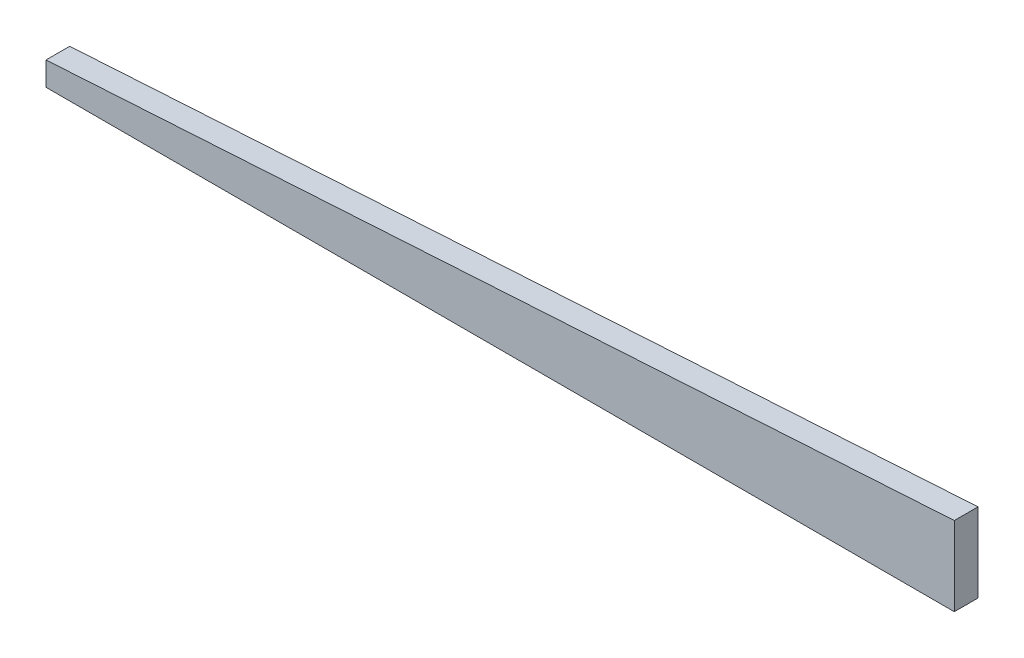
ISO-10303-21;
HEADER;
FILE_DESCRIPTION(('STEP AP214'),'2;1');
FILE_NAME('part.step','',(''),(''),'','','');
FILE_SCHEMA(('AUTOMOTIVE_DESIGN { 1 0 10303 214 1 1 1 1 }'));
ENDSEC;
DATA;
#1=APPLICATION_CONTEXT('core data for automotive mechanical design processes');
#2=APPLICATION_PROTOCOL_DEFINITION('international standard','automotive_design',2000,#1);
#3=PRODUCT_CONTEXT('',#1,'mechanical');
#4=PRODUCT('Part','Part','',(#3));
#5=PRODUCT_RELATED_PRODUCT_CATEGORY('part','',(#4));
#6=PRODUCT_DEFINITION_FORMATION('','',#4);
#7=PRODUCT_DEFINITION_CONTEXT('part definition',#1,'design');
#8=PRODUCT_DEFINITION('design','',#6,#7);
#9=PRODUCT_DEFINITION_SHAPE('','',#8);
#10=(LENGTH_UNIT() NAMED_UNIT(*) SI_UNIT(.MILLI.,.METRE.));
#11=(NAMED_UNIT(*) PLANE_ANGLE_UNIT() SI_UNIT($,.RADIAN.));
#12=(NAMED_UNIT(*) SI_UNIT($,.STERADIAN.) SOLID_ANGLE_UNIT());
#13=UNCERTAINTY_MEASURE_WITH_UNIT(LENGTH_MEASURE(1.E-05),#10,'distance_accuracy_value','');
#14=(GEOMETRIC_REPRESENTATION_CONTEXT(3) GLOBAL_UNCERTAINTY_ASSIGNED_CONTEXT((#13)) GLOBAL_UNIT_ASSIGNED_CONTEXT((#10,
#11,#12)) REPRESENTATION_CONTEXT('',''));
#15=CARTESIAN_POINT('',(0.,0.,0.));
#16=DIRECTION('',(0.,0.,1.));
#17=DIRECTION('',(1.,0.,0.));
#18=AXIS2_PLACEMENT_3D('',#15,#16,#17);
#19=CARTESIAN_POINT('',(0.,10.,3.));
#20=DIRECTION('',(-1.,0.,0.));
#21=DIRECTION('',(0.,0.,1.));
#22=AXIS2_PLACEMENT_3D('',#19,#20,#21);
#23=PLANE('',#22);
#24=DIRECTION('',(0.,1.,0.));
#25=VECTOR('',#24,1.);
#26=CARTESIAN_POINT('',(0.,10.,0.));
#27=LINE('',#26,#25);
#28=CARTESIAN_POINT('',(0.,0.,0.));
#29=VERTEX_POINT('',#28);
#30=CARTESIAN_POINT('',(0.,10.,0.));
#31=VERTEX_POINT('',#30);
#32=EDGE_CURVE('E95',#29,#31,#27,.T.);
#33=ORIENTED_EDGE('',*,*,#32,.T.);
#34=DIRECTION('',(0.,0.,-1.));
#35=VECTOR('',#34,1.);
#36=CARTESIAN_POINT('',(0.,10.,3.));
#37=LINE('',#36,#35);
#38=CARTESIAN_POINT('',(0.,10.,3.));
#39=VERTEX_POINT('',#38);
#40=EDGE_CURVE('E11',#39,#31,#37,.T.);
#41=ORIENTED_EDGE('',*,*,#40,.F.);
#42=DIRECTION('',(0.,1.,0.));
#43=VECTOR('',#42,1.);
#44=CARTESIAN_POINT('',(0.,10.,3.));
#45=LINE('',#44,#43);
#46=CARTESIAN_POINT('',(0.,0.,3.));
#47=VERTEX_POINT('',#46);
#48=EDGE_CURVE('E83',#47,#39,#45,.T.);
#49=ORIENTED_EDGE('',*,*,#48,.F.);
#50=DIRECTION('',(0.,0.,-1.));
#51=VECTOR('',#50,1.);
#52=CARTESIAN_POINT('',(0.,0.,3.));
#53=LINE('',#52,#51);
#54=EDGE_CURVE('E91',#47,#29,#53,.T.);
#55=ORIENTED_EDGE('',*,*,#54,.T.);
#56=EDGE_LOOP('',(#33,#41,#49,#55));
#57=FACE_BOUND('',#56,.T.);
#58=ADVANCED_FACE('F32',(#57),#23,.F.);
#59=CARTESIAN_POINT('',(-115.,2.99999999999999,3.));
#60=DIRECTION('',(0.0607571135710067,-0.998152580095107,0.));
#61=DIRECTION('',(0.998152580095107,0.0607571135710067,0.));
#62=AXIS2_PLACEMENT_3D('',#59,#60,#61);
#63=PLANE('',#62);
#64=DIRECTION('',(-0.998152580095107,-0.0607571135710067,0.));
#65=VECTOR('',#64,1.);
#66=CARTESIAN_POINT('',(-115.,2.99999999999999,0.));
#67=LINE('',#66,#65);
#68=CARTESIAN_POINT('',(-115.,2.99999999999999,0.));
#69=VERTEX_POINT('',#68);
#70=EDGE_CURVE('E87',#31,#69,#67,.T.);
#71=ORIENTED_EDGE('',*,*,#70,.T.);
#72=DIRECTION('',(0.,0.,-1.));
#73=VECTOR('',#72,1.);
#74=CARTESIAN_POINT('',(-115.,2.99999999999999,3.));
#75=LINE('',#74,#73);
#76=CARTESIAN_POINT('',(-115.,2.99999999999999,3.));
#77=VERTEX_POINT('',#76);
#78=EDGE_CURVE('E40',#77,#69,#75,.T.);
#79=ORIENTED_EDGE('',*,*,#78,.F.);
#80=DIRECTION('',(-0.998152580095107,-0.0607571135710067,0.));
#81=VECTOR('',#80,1.);
#82=CARTESIAN_POINT('',(-115.,2.99999999999999,3.));
#83=LINE('',#82,#81);
#84=EDGE_CURVE('E78',#39,#77,#83,.T.);
#85=ORIENTED_EDGE('',*,*,#84,.F.);
#86=ORIENTED_EDGE('',*,*,#40,.T.);
#87=EDGE_LOOP('',(#71,#79,#85,#86));
#88=FACE_BOUND('',#87,.T.);
#89=ADVANCED_FACE('F86',(#88),#63,.F.);
#90=CARTESIAN_POINT('',(-115.,0.,3.));
#91=DIRECTION('',(1.,0.,0.));
#92=DIRECTION('',(0.,0.,-1.));
#93=AXIS2_PLACEMENT_3D('',#90,#91,#92);
#94=PLANE('',#93);
#95=DIRECTION('',(0.,-1.,0.));
#96=VECTOR('',#95,1.);
#97=CARTESIAN_POINT('',(-115.,0.,0.));
#98=LINE('',#97,#96);
#99=CARTESIAN_POINT('',(-115.,0.,0.));
#100=VERTEX_POINT('',#99);
#101=EDGE_CURVE('E65',#69,#100,#98,.T.);
#102=ORIENTED_EDGE('',*,*,#101,.T.);
#103=DIRECTION('',(0.,0.,-1.));
#104=VECTOR('',#103,1.);
#105=CARTESIAN_POINT('',(-115.,0.,3.));
#106=LINE('',#105,#104);
#107=CARTESIAN_POINT('',(-115.,0.,3.));
#108=VERTEX_POINT('',#107);
#109=EDGE_CURVE('E88',#108,#100,#106,.T.);
#110=ORIENTED_EDGE('',*,*,#109,.F.);
#111=DIRECTION('',(0.,-1.,0.));
#112=VECTOR('',#111,1.);
#113=CARTESIAN_POINT('',(-115.,0.,3.));
#114=LINE('',#113,#112);
#115=EDGE_CURVE('E81',#77,#108,#114,.T.);
#116=ORIENTED_EDGE('',*,*,#115,.F.);
#117=ORIENTED_EDGE('',*,*,#78,.T.);
#118=EDGE_LOOP('',(#102,#110,#116,#117));
#119=FACE_BOUND('',#118,.T.);
#120=ADVANCED_FACE('F89',(#119),#94,.F.);
#121=CARTESIAN_POINT('',(0.,0.,3.));
#122=DIRECTION('',(0.,1.,0.));
#123=DIRECTION('',(-1.,0.,0.));
#124=AXIS2_PLACEMENT_3D('',#121,#122,#123);
#125=PLANE('',#124);
#126=DIRECTION('',(1.,0.,0.));
#127=VECTOR('',#126,1.);
#128=CARTESIAN_POINT('',(0.,0.,0.));
#129=LINE('',#128,#127);
#130=EDGE_CURVE('E71',#100,#29,#129,.T.);
#131=ORIENTED_EDGE('',*,*,#130,.T.);
#132=ORIENTED_EDGE('',*,*,#54,.F.);
#133=DIRECTION('',(1.,0.,0.));
#134=VECTOR('',#133,1.);
#135=CARTESIAN_POINT('',(0.,0.,3.));
#136=LINE('',#135,#134);
#137=EDGE_CURVE('E48',#108,#47,#136,.T.);
#138=ORIENTED_EDGE('',*,*,#137,.F.);
#139=ORIENTED_EDGE('',*,*,#109,.T.);
#140=EDGE_LOOP('',(#131,#132,#138,#139));
#141=FACE_BOUND('',#140,.T.);
#142=ADVANCED_FACE('F102',(#141),#125,.F.);
#143=CARTESIAN_POINT('',(0.,0.,3.));
#144=DIRECTION('',(0.,0.,-1.));
#145=DIRECTION('',(-1.,0.,0.));
#146=AXIS2_PLACEMENT_3D('',#143,#144,#145);
#147=PLANE('',#146);
#148=ORIENTED_EDGE('',*,*,#48,.T.);
#149=ORIENTED_EDGE('',*,*,#84,.T.);
#150=ORIENTED_EDGE('',*,*,#115,.T.);
#151=ORIENTED_EDGE('',*,*,#137,.T.);
#152=EDGE_LOOP('',(#148,#149,#150,#151));
#153=FACE_BOUND('',#152,.T.);
#154=ADVANCED_FACE('F79',(#153),#147,.F.);
#155=CARTESIAN_POINT('',(0.,0.,0.));
#156=DIRECTION('',(0.,0.,-1.));
#157=DIRECTION('',(-1.,0.,0.));
#158=AXIS2_PLACEMENT_3D('',#155,#156,#157);
#159=PLANE('',#158);
#160=ORIENTED_EDGE('',*,*,#32,.F.);
#161=ORIENTED_EDGE('',*,*,#130,.F.);
#162=ORIENTED_EDGE('',*,*,#101,.F.);
#163=ORIENTED_EDGE('',*,*,#70,.F.);
#164=EDGE_LOOP('',(#160,#161,#162,#163));
#165=FACE_BOUND('',#164,.T.);
#166=ADVANCED_FACE('F105',(#165),#159,.T.);
#167=CLOSED_SHELL('',(#58,#89,#120,#142,#154,#166));
#168=MANIFOLD_SOLID_BREP('B2',#167);
#169=ADVANCED_BREP_SHAPE_REPRESENTATION('',(#18,#168),#14);
#170=SHAPE_DEFINITION_REPRESENTATION(#9,#169);
ENDSEC;
END-ISO-10303-21;
